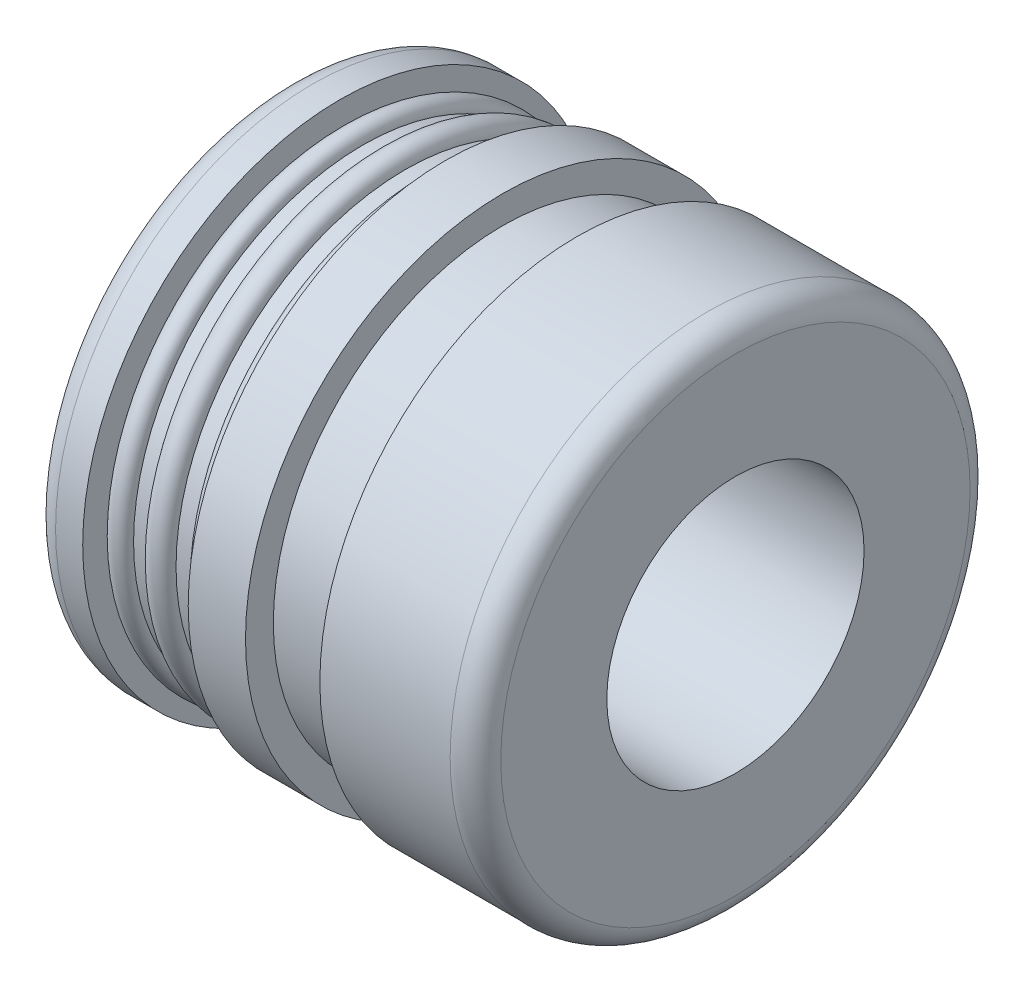
ISO-10303-21;
HEADER;
FILE_DESCRIPTION(('STEP AP214'),'2;1');
FILE_NAME('part.step','',(''),(''),'','','');
FILE_SCHEMA(('AUTOMOTIVE_DESIGN { 1 0 10303 214 1 1 1 1 }'));
ENDSEC;
DATA;
#1=APPLICATION_CONTEXT('core data for automotive mechanical design processes');
#2=APPLICATION_PROTOCOL_DEFINITION('international standard','automotive_design',2000,#1);
#3=PRODUCT_CONTEXT('',#1,'mechanical');
#4=PRODUCT('Part','Part','',(#3));
#5=PRODUCT_RELATED_PRODUCT_CATEGORY('part','',(#4));
#6=PRODUCT_DEFINITION_FORMATION('','',#4);
#7=PRODUCT_DEFINITION_CONTEXT('part definition',#1,'design');
#8=PRODUCT_DEFINITION('design','',#6,#7);
#9=PRODUCT_DEFINITION_SHAPE('','',#8);
#10=(LENGTH_UNIT() NAMED_UNIT(*) SI_UNIT(.MILLI.,.METRE.));
#11=(NAMED_UNIT(*) PLANE_ANGLE_UNIT() SI_UNIT($,.RADIAN.));
#12=(NAMED_UNIT(*) SI_UNIT($,.STERADIAN.) SOLID_ANGLE_UNIT());
#13=UNCERTAINTY_MEASURE_WITH_UNIT(LENGTH_MEASURE(1.E-05),#10,'distance_accuracy_value','');
#14=(GEOMETRIC_REPRESENTATION_CONTEXT(3) GLOBAL_UNCERTAINTY_ASSIGNED_CONTEXT((#13)) GLOBAL_UNIT_ASSIGNED_CONTEXT((#10,
#11,#12)) REPRESENTATION_CONTEXT('',''));
#15=CARTESIAN_POINT('',(0.,0.,0.));
#16=DIRECTION('',(0.,0.,1.));
#17=DIRECTION('',(1.,0.,0.));
#18=AXIS2_PLACEMENT_3D('',#15,#16,#17);
#19=CARTESIAN_POINT('',(0.,0.,0.));
#20=DIRECTION('',(1.,0.,0.));
#21=DIRECTION('',(0.,0.,-1.));
#22=AXIS2_PLACEMENT_3D('',#19,#20,#21);
#23=CYLINDRICAL_SURFACE('',#22,11.3266110104548);
#24=CARTESIAN_POINT('',(-6.60162257440151,0.,0.));
#25=DIRECTION('',(1.,0.,0.));
#26=DIRECTION('',(0.,0.,-1.));
#27=AXIS2_PLACEMENT_3D('',#24,#25,#26);
#28=CIRCLE('',#27,11.3266110104548);
#29=CARTESIAN_POINT('',(-6.60162257440151,0.,-11.3266110104548));
#30=VERTEX_POINT('',#29);
#31=EDGE_CURVE('E10',#30,#30,#28,.T.);
#32=ORIENTED_EDGE('',*,*,#31,.T.);
#33=EDGE_LOOP('',(#32));
#34=FACE_BOUND('',#33,.T.);
#35=CARTESIAN_POINT('',(-5.76490323788749,0.,0.));
#36=DIRECTION('',(1.,0.,0.));
#37=DIRECTION('',(0.,0.,-1.));
#38=AXIS2_PLACEMENT_3D('',#35,#36,#37);
#39=CIRCLE('',#38,11.3266110104548);
#40=CARTESIAN_POINT('',(-5.76490323788749,0.,-11.3266110104548));
#41=VERTEX_POINT('',#40);
#42=EDGE_CURVE('E122',#41,#41,#39,.T.);
#43=ORIENTED_EDGE('',*,*,#42,.F.);
#44=EDGE_LOOP('',(#43));
#45=FACE_BOUND('',#44,.T.);
#46=ADVANCED_FACE('F39',(#34,#45),#23,.T.);
#47=CARTESIAN_POINT('',(-7.14092513246593,0.,0.));
#48=DIRECTION('',(1.,0.,0.));
#49=DIRECTION('',(0.,0.,-1.));
#50=AXIS2_PLACEMENT_3D('',#47,#48,#49);
#51=TOROIDAL_SURFACE('',#50,11.3266110104548,0.539302558064423);
#52=CARTESIAN_POINT('',(-7.68022769053035,0.,0.));
#53=DIRECTION('',(1.,0.,0.));
#54=DIRECTION('',(0.,0.,-1.));
#55=AXIS2_PLACEMENT_3D('',#52,#53,#54);
#56=CIRCLE('',#55,11.3266110104548);
#57=CARTESIAN_POINT('',(-7.68022769053035,0.,-11.3266110104548));
#58=VERTEX_POINT('',#57);
#59=EDGE_CURVE('E46',#58,#58,#56,.T.);
#60=ORIENTED_EDGE('',*,*,#59,.T.);
#61=EDGE_LOOP('',(#60));
#62=FACE_BOUND('',#61,.T.);
#63=ORIENTED_EDGE('',*,*,#31,.F.);
#64=EDGE_LOOP('',(#63));
#65=FACE_BOUND('',#64,.T.);
#66=ADVANCED_FACE('F131',(#62,#65),#51,.T.);
#67=CARTESIAN_POINT('',(0.,0.,0.));
#68=DIRECTION('',(1.,0.,0.));
#69=DIRECTION('',(0.,0.,-1.));
#70=AXIS2_PLACEMENT_3D('',#67,#68,#69);
#71=CYLINDRICAL_SURFACE('',#70,11.3266110104548);
#72=CARTESIAN_POINT('',(-7.73913594923349,0.,0.));
#73=DIRECTION('',(1.,0.,0.));
#74=DIRECTION('',(0.,0.,-1.));
#75=AXIS2_PLACEMENT_3D('',#72,#73,#74);
#76=CIRCLE('',#75,11.3266110104548);
#77=CARTESIAN_POINT('',(-7.73913594923349,0.,-11.3266110104548));
#78=VERTEX_POINT('',#77);
#79=EDGE_CURVE('E51',#78,#78,#76,.T.);
#80=ORIENTED_EDGE('',*,*,#79,.T.);
#81=EDGE_LOOP('',(#80));
#82=FACE_BOUND('',#81,.T.);
#83=ORIENTED_EDGE('',*,*,#59,.F.);
#84=EDGE_LOOP('',(#83));
#85=FACE_BOUND('',#84,.T.);
#86=ADVANCED_FACE('F135',(#82,#85),#71,.T.);
#87=CARTESIAN_POINT('',(-7.73913594923349,0.,0.));
#88=DIRECTION('',(1.,0.,0.));
#89=DIRECTION('',(0.,0.,-1.));
#90=AXIS2_PLACEMENT_3D('',#87,#88,#89);
#91=PLANE('',#90);
#92=CARTESIAN_POINT('',(-7.73913594923349,0.,0.));
#93=DIRECTION('',(1.,0.,0.));
#94=DIRECTION('',(0.,0.,-1.));
#95=AXIS2_PLACEMENT_3D('',#92,#93,#94);
#96=CIRCLE('',#95,12.7);
#97=CARTESIAN_POINT('',(-7.73913594923349,0.,-12.7));
#98=VERTEX_POINT('',#97);
#99=EDGE_CURVE('E56',#98,#98,#96,.T.);
#100=ORIENTED_EDGE('',*,*,#99,.T.);
#101=EDGE_LOOP('',(#100));
#102=FACE_BOUND('',#101,.T.);
#103=ORIENTED_EDGE('',*,*,#79,.F.);
#104=EDGE_LOOP('',(#103));
#105=FACE_BOUND('',#104,.T.);
#106=ADVANCED_FACE('F139',(#102,#105),#91,.T.);
#107=CARTESIAN_POINT('',(0.,0.,0.));
#108=DIRECTION('',(1.,0.,0.));
#109=DIRECTION('',(0.,0.,-1.));
#110=AXIS2_PLACEMENT_3D('',#107,#108,#109);
#111=CYLINDRICAL_SURFACE('',#110,12.7);
#112=CARTESIAN_POINT('',(-9.07860178660083,0.,0.));
#113=DIRECTION('',(1.,0.,0.));
#114=DIRECTION('',(0.,0.,-1.));
#115=AXIS2_PLACEMENT_3D('',#112,#113,#114);
#116=CIRCLE('',#115,12.7);
#117=CARTESIAN_POINT('',(-9.07860178660083,0.,-12.7));
#118=VERTEX_POINT('',#117);
#119=EDGE_CURVE('E62',#118,#118,#116,.T.);
#120=ORIENTED_EDGE('',*,*,#119,.T.);
#121=EDGE_LOOP('',(#120));
#122=FACE_BOUND('',#121,.T.);
#123=ORIENTED_EDGE('',*,*,#99,.F.);
#124=EDGE_LOOP('',(#123));
#125=FACE_BOUND('',#124,.T.);
#126=ADVANCED_FACE('F146',(#122,#125),#111,.T.);
#127=CARTESIAN_POINT('',(-9.00880639852778,0.,0.));
#128=DIRECTION('',(1.,0.,0.));
#129=DIRECTION('',(0.,0.,-1.));
#130=AXIS2_PLACEMENT_3D('',#127,#128,#129);
#131=TOROIDAL_SURFACE('',#130,11.3964063985278,1.30546071330989);
#132=ORIENTED_EDGE('',*,*,#119,.F.);
#133=EDGE_LOOP('',(#132));
#134=FACE_BOUND('',#133,.T.);
#135=CARTESIAN_POINT('',(-10.3124,0.,0.));
#136=DIRECTION('',(1.,0.,0.));
#137=DIRECTION('',(0.,0.,-1.));
#138=AXIS2_PLACEMENT_3D('',#135,#136,#137);
#139=CIRCLE('',#138,11.3266110104548);
#140=CARTESIAN_POINT('',(-10.3124,0.,-11.3266110104548));
#141=VERTEX_POINT('',#140);
#142=EDGE_CURVE('E66',#141,#141,#139,.T.);
#143=ORIENTED_EDGE('',*,*,#142,.T.);
#144=EDGE_LOOP('',(#143));
#145=FACE_BOUND('',#144,.T.);
#146=ADVANCED_FACE('F150',(#134,#145),#131,.T.);
#147=CARTESIAN_POINT('',(-10.3124,0.,0.));
#148=DIRECTION('',(1.,0.,0.));
#149=DIRECTION('',(0.,0.,-1.));
#150=AXIS2_PLACEMENT_3D('',#147,#148,#149);
#151=PLANE('',#150);
#152=ORIENTED_EDGE('',*,*,#142,.F.);
#153=EDGE_LOOP('',(#152));
#154=FACE_BOUND('',#153,.T.);
#155=CARTESIAN_POINT('',(-10.3124,0.,0.));
#156=DIRECTION('',(1.,0.,0.));
#157=DIRECTION('',(0.,0.,-1.));
#158=AXIS2_PLACEMENT_3D('',#155,#156,#157);
#159=CIRCLE('',#158,6.35);
#160=CARTESIAN_POINT('',(-10.3124,0.,-6.35));
#161=VERTEX_POINT('',#160);
#162=EDGE_CURVE('E70',#161,#161,#159,.T.);
#163=ORIENTED_EDGE('',*,*,#162,.T.);
#164=EDGE_LOOP('',(#163));
#165=FACE_BOUND('',#164,.T.);
#166=ADVANCED_FACE('F154',(#154,#165),#151,.F.);
#167=CARTESIAN_POINT('',(0.,0.,0.));
#168=DIRECTION('',(1.,0.,0.));
#169=DIRECTION('',(0.,0.,-1.));
#170=AXIS2_PLACEMENT_3D('',#167,#168,#169);
#171=CYLINDRICAL_SURFACE('',#170,6.35);
#172=ORIENTED_EDGE('',*,*,#162,.F.);
#173=EDGE_LOOP('',(#172));
#174=FACE_BOUND('',#173,.T.);
#175=CARTESIAN_POINT('',(11.7856,0.,0.));
#176=DIRECTION('',(1.,0.,0.));
#177=DIRECTION('',(0.,0.,-1.));
#178=AXIS2_PLACEMENT_3D('',#175,#176,#177);
#179=CIRCLE('',#178,6.35);
#180=CARTESIAN_POINT('',(11.7856,0.,-6.35));
#181=VERTEX_POINT('',#180);
#182=EDGE_CURVE('E74',#181,#181,#179,.T.);
#183=ORIENTED_EDGE('',*,*,#182,.T.);
#184=EDGE_LOOP('',(#183));
#185=FACE_BOUND('',#184,.T.);
#186=ADVANCED_FACE('F158',(#174,#185),#171,.F.);
#187=CARTESIAN_POINT('',(11.7856,0.,0.));
#188=DIRECTION('',(-1.,0.,0.));
#189=DIRECTION('',(0.,0.,1.));
#190=AXIS2_PLACEMENT_3D('',#187,#188,#189);
#191=PLANE('',#190);
#192=ORIENTED_EDGE('',*,*,#182,.F.);
#193=EDGE_LOOP('',(#192));
#194=FACE_BOUND('',#193,.T.);
#195=CARTESIAN_POINT('',(11.7856,0.,0.));
#196=DIRECTION('',(1.,0.,0.));
#197=DIRECTION('',(0.,0.,-1.));
#198=AXIS2_PLACEMENT_3D('',#195,#196,#197);
#199=CIRCLE('',#198,11.583899000936);
#200=CARTESIAN_POINT('',(11.7856,0.,-11.583899000936));
#201=VERTEX_POINT('',#200);
#202=EDGE_CURVE('E78',#201,#201,#199,.T.);
#203=ORIENTED_EDGE('',*,*,#202,.T.);
#204=EDGE_LOOP('',(#203));
#205=FACE_BOUND('',#204,.T.);
#206=ADVANCED_FACE('F162',(#194,#205),#191,.F.);
#207=CARTESIAN_POINT('',(10.5352656780045,0.,0.));
#208=DIRECTION('',(1.,0.,0.));
#209=DIRECTION('',(0.,0.,-1.));
#210=AXIS2_PLACEMENT_3D('',#207,#208,#209);
#211=TOROIDAL_SURFACE('',#210,11.4496656780045,1.25751918543819);
#212=CARTESIAN_POINT('',(10.401032355073,0.,0.));
#213=DIRECTION('',(1.,0.,0.));
#214=DIRECTION('',(0.,0.,-1.));
#215=AXIS2_PLACEMENT_3D('',#212,#213,#214);
#216=CIRCLE('',#215,12.7);
#217=CARTESIAN_POINT('',(10.401032355073,0.,-12.7));
#218=VERTEX_POINT('',#217);
#219=EDGE_CURVE('E82',#218,#218,#216,.T.);
#220=ORIENTED_EDGE('',*,*,#219,.T.);
#221=EDGE_LOOP('',(#220));
#222=FACE_BOUND('',#221,.T.);
#223=ORIENTED_EDGE('',*,*,#202,.F.);
#224=EDGE_LOOP('',(#223));
#225=FACE_BOUND('',#224,.T.);
#226=ADVANCED_FACE('F166',(#222,#225),#211,.T.);
#227=CARTESIAN_POINT('',(0.,0.,0.));
#228=DIRECTION('',(1.,0.,0.));
#229=DIRECTION('',(0.,0.,-1.));
#230=AXIS2_PLACEMENT_3D('',#227,#228,#229);
#231=CYLINDRICAL_SURFACE('',#230,12.7);
#232=CARTESIAN_POINT('',(3.96878766627359,0.,0.));
#233=DIRECTION('',(1.,0.,0.));
#234=DIRECTION('',(0.,0.,-1.));
#235=AXIS2_PLACEMENT_3D('',#232,#233,#234);
#236=CIRCLE('',#235,12.7);
#237=CARTESIAN_POINT('',(3.96878766627359,0.,-12.7));
#238=VERTEX_POINT('',#237);
#239=EDGE_CURVE('E86',#238,#238,#236,.T.);
#240=ORIENTED_EDGE('',*,*,#239,.T.);
#241=EDGE_LOOP('',(#240));
#242=FACE_BOUND('',#241,.T.);
#243=ORIENTED_EDGE('',*,*,#219,.F.);
#244=EDGE_LOOP('',(#243));
#245=FACE_BOUND('',#244,.T.);
#246=ADVANCED_FACE('F170',(#242,#245),#231,.T.);
#247=CARTESIAN_POINT('',(3.96878766627359,0.,0.));
#248=DIRECTION('',(-1.,0.,0.));
#249=DIRECTION('',(0.,0.,1.));
#250=AXIS2_PLACEMENT_3D('',#247,#248,#249);
#251=PLANE('',#250);
#252=CARTESIAN_POINT('',(3.96878766627359,0.,0.));
#253=DIRECTION('',(1.,0.,0.));
#254=DIRECTION('',(0.,0.,-1.));
#255=AXIS2_PLACEMENT_3D('',#252,#253,#254);
#256=CIRCLE('',#255,11.3266110104548);
#257=CARTESIAN_POINT('',(3.96878766627359,0.,-11.3266110104548));
#258=VERTEX_POINT('',#257);
#259=EDGE_CURVE('E90',#258,#258,#256,.T.);
#260=ORIENTED_EDGE('',*,*,#259,.T.);
#261=EDGE_LOOP('',(#260));
#262=FACE_BOUND('',#261,.T.);
#263=ORIENTED_EDGE('',*,*,#239,.F.);
#264=EDGE_LOOP('',(#263));
#265=FACE_BOUND('',#264,.T.);
#266=ADVANCED_FACE('F174',(#262,#265),#251,.T.);
#267=CARTESIAN_POINT('',(0.,0.,0.));
#268=DIRECTION('',(1.,0.,0.));
#269=DIRECTION('',(0.,0.,-1.));
#270=AXIS2_PLACEMENT_3D('',#267,#268,#269);
#271=CYLINDRICAL_SURFACE('',#270,11.3266110104548);
#272=CARTESIAN_POINT('',(0.297659074970522,0.,0.));
#273=DIRECTION('',(1.,0.,0.));
#274=DIRECTION('',(0.,0.,-1.));
#275=AXIS2_PLACEMENT_3D('',#272,#273,#274);
#276=CIRCLE('',#275,11.3266110104548);
#277=CARTESIAN_POINT('',(0.297659074970522,0.,-11.3266110104548));
#278=VERTEX_POINT('',#277);
#279=EDGE_CURVE('E94',#278,#278,#276,.T.);
#280=ORIENTED_EDGE('',*,*,#279,.T.);
#281=EDGE_LOOP('',(#280));
#282=FACE_BOUND('',#281,.T.);
#283=ORIENTED_EDGE('',*,*,#259,.F.);
#284=EDGE_LOOP('',(#283));
#285=FACE_BOUND('',#284,.T.);
#286=ADVANCED_FACE('F178',(#282,#285),#271,.T.);
#287=CARTESIAN_POINT('',(0.297659074970522,0.,0.));
#288=DIRECTION('',(1.,0.,0.));
#289=DIRECTION('',(0.,0.,-1.));
#290=AXIS2_PLACEMENT_3D('',#287,#288,#289);
#291=PLANE('',#290);
#292=CARTESIAN_POINT('',(0.297659074970522,0.,0.));
#293=DIRECTION('',(1.,0.,0.));
#294=DIRECTION('',(0.,0.,-1.));
#295=AXIS2_PLACEMENT_3D('',#292,#293,#294);
#296=CIRCLE('',#295,12.7);
#297=CARTESIAN_POINT('',(0.297659074970522,0.,-12.7));
#298=VERTEX_POINT('',#297);
#299=EDGE_CURVE('E98',#298,#298,#296,.T.);
#300=ORIENTED_EDGE('',*,*,#299,.T.);
#301=EDGE_LOOP('',(#300));
#302=FACE_BOUND('',#301,.T.);
#303=ORIENTED_EDGE('',*,*,#279,.F.);
#304=EDGE_LOOP('',(#303));
#305=FACE_BOUND('',#304,.T.);
#306=ADVANCED_FACE('F182',(#302,#305),#291,.T.);
#307=CARTESIAN_POINT('',(0.,0.,0.));
#308=DIRECTION('',(1.,0.,0.));
#309=DIRECTION('',(0.,0.,-1.));
#310=AXIS2_PLACEMENT_3D('',#307,#308,#309);
#311=CYLINDRICAL_SURFACE('',#310,12.7);
#312=CARTESIAN_POINT('',(-2.53010213724941,0.,0.));
#313=DIRECTION('',(1.,0.,0.));
#314=DIRECTION('',(0.,0.,-1.));
#315=AXIS2_PLACEMENT_3D('',#312,#313,#314);
#316=CIRCLE('',#315,12.7);
#317=CARTESIAN_POINT('',(-2.53010213724941,0.,-12.7));
#318=VERTEX_POINT('',#317);
#319=EDGE_CURVE('E102',#318,#318,#316,.T.);
#320=ORIENTED_EDGE('',*,*,#319,.T.);
#321=EDGE_LOOP('',(#320));
#322=FACE_BOUND('',#321,.T.);
#323=ORIENTED_EDGE('',*,*,#299,.F.);
#324=EDGE_LOOP('',(#323));
#325=FACE_BOUND('',#324,.T.);
#326=ADVANCED_FACE('F186',(#322,#325),#311,.T.);
#327=CARTESIAN_POINT('',(-2.53010213724941,0.,0.));
#328=DIRECTION('',(-1.,0.,0.));
#329=DIRECTION('',(0.,0.,1.));
#330=AXIS2_PLACEMENT_3D('',#327,#328,#329);
#331=PLANE('',#330);
#332=CARTESIAN_POINT('',(-2.53010213724941,0.,0.));
#333=DIRECTION('',(1.,0.,0.));
#334=DIRECTION('',(0.,0.,-1.));
#335=AXIS2_PLACEMENT_3D('',#332,#333,#334);
#336=CIRCLE('',#335,11.3266110104548);
#337=CARTESIAN_POINT('',(-2.53010213724941,0.,-11.3266110104548));
#338=VERTEX_POINT('',#337);
#339=EDGE_CURVE('E106',#338,#338,#336,.T.);
#340=ORIENTED_EDGE('',*,*,#339,.T.);
#341=EDGE_LOOP('',(#340));
#342=FACE_BOUND('',#341,.T.);
#343=ORIENTED_EDGE('',*,*,#319,.F.);
#344=EDGE_LOOP('',(#343));
#345=FACE_BOUND('',#344,.T.);
#346=ADVANCED_FACE('F190',(#342,#345),#331,.T.);
#347=CARTESIAN_POINT('',(0.,0.,0.));
#348=DIRECTION('',(1.,0.,0.));
#349=DIRECTION('',(0.,0.,-1.));
#350=AXIS2_PLACEMENT_3D('',#347,#348,#349);
#351=CYLINDRICAL_SURFACE('',#350,11.3266110104548);
#352=CARTESIAN_POINT('',(-2.57407510239289,0.,0.));
#353=DIRECTION('',(1.,0.,0.));
#354=DIRECTION('',(0.,0.,-1.));
#355=AXIS2_PLACEMENT_3D('',#352,#353,#354);
#356=CIRCLE('',#355,11.3266110104548);
#357=CARTESIAN_POINT('',(-2.57407510239289,0.,-11.3266110104548));
#358=VERTEX_POINT('',#357);
#359=EDGE_CURVE('E110',#358,#358,#356,.T.);
#360=ORIENTED_EDGE('',*,*,#359,.T.);
#361=EDGE_LOOP('',(#360));
#362=FACE_BOUND('',#361,.T.);
#363=ORIENTED_EDGE('',*,*,#339,.F.);
#364=EDGE_LOOP('',(#363));
#365=FACE_BOUND('',#364,.T.);
#366=ADVANCED_FACE('F194',(#362,#365),#351,.T.);
#367=CARTESIAN_POINT('',(-3.08616886257416,0.,0.));
#368=DIRECTION('',(1.,0.,0.));
#369=DIRECTION('',(0.,0.,-1.));
#370=AXIS2_PLACEMENT_3D('',#367,#368,#369);
#371=TOROIDAL_SURFACE('',#370,11.3266110104548,0.512093760181273);
#372=CARTESIAN_POINT('',(-3.59826262275543,0.,0.));
#373=DIRECTION('',(1.,0.,0.));
#374=DIRECTION('',(0.,0.,-1.));
#375=AXIS2_PLACEMENT_3D('',#372,#373,#374);
#376=CIRCLE('',#375,11.3266110104548);
#377=CARTESIAN_POINT('',(-3.59826262275543,0.,-11.3266110104548));
#378=VERTEX_POINT('',#377);
#379=EDGE_CURVE('E114',#378,#378,#376,.T.);
#380=ORIENTED_EDGE('',*,*,#379,.T.);
#381=EDGE_LOOP('',(#380));
#382=FACE_BOUND('',#381,.T.);
#383=ORIENTED_EDGE('',*,*,#359,.F.);
#384=EDGE_LOOP('',(#383));
#385=FACE_BOUND('',#384,.T.);
#386=ADVANCED_FACE('F198',(#382,#385),#371,.T.);
#387=CARTESIAN_POINT('',(0.,0.,0.));
#388=DIRECTION('',(1.,0.,0.));
#389=DIRECTION('',(0.,0.,-1.));
#390=AXIS2_PLACEMENT_3D('',#387,#388,#389);
#391=CYLINDRICAL_SURFACE('',#390,11.3266110104548);
#392=CARTESIAN_POINT('',(-4.50433484859542,0.,0.));
#393=DIRECTION('',(1.,0.,0.));
#394=DIRECTION('',(0.,0.,-1.));
#395=AXIS2_PLACEMENT_3D('',#392,#393,#394);
#396=CIRCLE('',#395,11.3266110104548);
#397=CARTESIAN_POINT('',(-4.50433484859542,0.,-11.3266110104548));
#398=VERTEX_POINT('',#397);
#399=EDGE_CURVE('E118',#398,#398,#396,.T.);
#400=ORIENTED_EDGE('',*,*,#399,.T.);
#401=EDGE_LOOP('',(#400));
#402=FACE_BOUND('',#401,.T.);
#403=ORIENTED_EDGE('',*,*,#379,.F.);
#404=EDGE_LOOP('',(#403));
#405=FACE_BOUND('',#404,.T.);
#406=ADVANCED_FACE('F202',(#402,#405),#391,.T.);
#407=CARTESIAN_POINT('',(-5.13461904324145,0.,0.));
#408=DIRECTION('',(1.,0.,0.));
#409=DIRECTION('',(0.,0.,-1.));
#410=AXIS2_PLACEMENT_3D('',#407,#408,#409);
#411=TOROIDAL_SURFACE('',#410,11.3266110104548,0.630284194646033);
#412=ORIENTED_EDGE('',*,*,#42,.T.);
#413=EDGE_LOOP('',(#412));
#414=FACE_BOUND('',#413,.T.);
#415=ORIENTED_EDGE('',*,*,#399,.F.);
#416=EDGE_LOOP('',(#415));
#417=FACE_BOUND('',#416,.T.);
#418=ADVANCED_FACE('F127',(#414,#417),#411,.T.);
#419=CLOSED_SHELL('',(#46,#66,#86,#106,#126,#146,#166,#186,#206,#226,#246,#266,#286,#306,#326,
#346,#366,#386,#406,#418));
#420=MANIFOLD_SOLID_BREP('B2',#419);
#421=ADVANCED_BREP_SHAPE_REPRESENTATION('',(#18,#420),#14);
#422=SHAPE_DEFINITION_REPRESENTATION(#9,#421);
ENDSEC;
END-ISO-10303-21;
